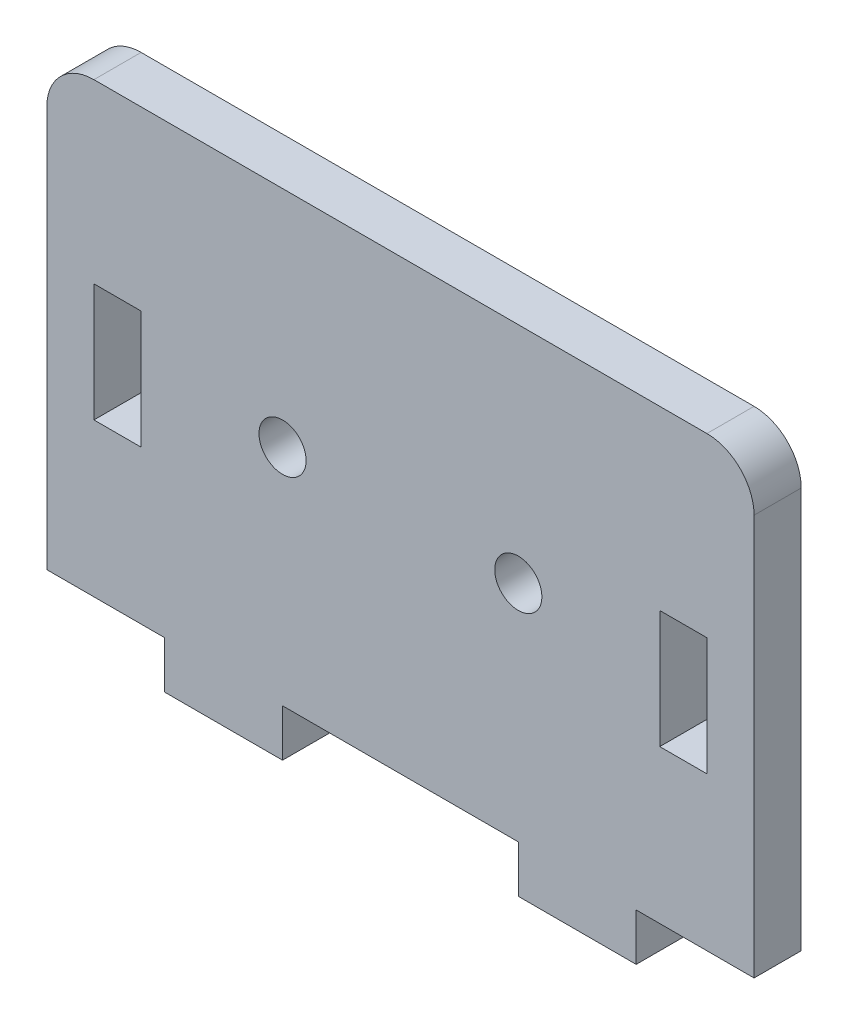
ISO-10303-21;
HEADER;
FILE_DESCRIPTION(('STEP AP214'),'2;1');
FILE_NAME('part.step','',(''),(''),'','','');
FILE_SCHEMA(('AUTOMOTIVE_DESIGN { 1 0 10303 214 1 1 1 1 }'));
ENDSEC;
DATA;
#1=APPLICATION_CONTEXT('core data for automotive mechanical design processes');
#2=APPLICATION_PROTOCOL_DEFINITION('international standard','automotive_design',2000,#1);
#3=PRODUCT_CONTEXT('',#1,'mechanical');
#4=PRODUCT('Part','Part','',(#3));
#5=PRODUCT_RELATED_PRODUCT_CATEGORY('part','',(#4));
#6=PRODUCT_DEFINITION_FORMATION('','',#4);
#7=PRODUCT_DEFINITION_CONTEXT('part definition',#1,'design');
#8=PRODUCT_DEFINITION('design','',#6,#7);
#9=PRODUCT_DEFINITION_SHAPE('','',#8);
#10=(LENGTH_UNIT() NAMED_UNIT(*) SI_UNIT(.MILLI.,.METRE.));
#11=(NAMED_UNIT(*) PLANE_ANGLE_UNIT() SI_UNIT($,.RADIAN.));
#12=(NAMED_UNIT(*) SI_UNIT($,.STERADIAN.) SOLID_ANGLE_UNIT());
#13=UNCERTAINTY_MEASURE_WITH_UNIT(LENGTH_MEASURE(1.E-05),#10,'distance_accuracy_value','');
#14=(GEOMETRIC_REPRESENTATION_CONTEXT(3) GLOBAL_UNCERTAINTY_ASSIGNED_CONTEXT((#13)) GLOBAL_UNIT_ASSIGNED_CONTEXT((#10,
#11,#12)) REPRESENTATION_CONTEXT('',''));
#15=CARTESIAN_POINT('',(0.,0.,0.));
#16=DIRECTION('',(0.,0.,1.));
#17=DIRECTION('',(1.,0.,0.));
#18=AXIS2_PLACEMENT_3D('',#15,#16,#17);
#19=CARTESIAN_POINT('',(-26.,15.,4.));
#20=DIRECTION('',(0.,0.,1.));
#21=DIRECTION('',(1.,0.,0.));
#22=AXIS2_PLACEMENT_3D('',#19,#20,#21);
#23=PLANE('',#22);
#24=DIRECTION('',(1.,0.,0.));
#25=VECTOR('',#24,1.);
#26=CARTESIAN_POINT('',(-26.,-6.,4.));
#27=LINE('',#26,#25);
#28=CARTESIAN_POINT('',(-26.,-6.,4.));
#29=VERTEX_POINT('',#28);
#30=CARTESIAN_POINT('',(-22.,-6.,4.));
#31=VERTEX_POINT('',#30);
#32=EDGE_CURVE('E221',#29,#31,#27,.T.);
#33=ORIENTED_EDGE('',*,*,#32,.F.);
#34=DIRECTION('',(0.,-1.,0.));
#35=VECTOR('',#34,1.);
#36=CARTESIAN_POINT('',(-26.,4.,4.));
#37=LINE('',#36,#35);
#38=CARTESIAN_POINT('',(-26.,4.,4.));
#39=VERTEX_POINT('',#38);
#40=EDGE_CURVE('E219',#39,#29,#37,.T.);
#41=ORIENTED_EDGE('',*,*,#40,.F.);
#42=DIRECTION('',(-1.,0.,0.));
#43=VECTOR('',#42,1.);
#44=CARTESIAN_POINT('',(-26.,4.,4.));
#45=LINE('',#44,#43);
#46=CARTESIAN_POINT('',(-22.,4.,4.));
#47=VERTEX_POINT('',#46);
#48=EDGE_CURVE('E227',#47,#39,#45,.T.);
#49=ORIENTED_EDGE('',*,*,#48,.F.);
#50=DIRECTION('',(0.,1.,0.));
#51=VECTOR('',#50,1.);
#52=CARTESIAN_POINT('',(-22.,4.,4.));
#53=LINE('',#52,#51);
#54=EDGE_CURVE('E224',#31,#47,#53,.T.);
#55=ORIENTED_EDGE('',*,*,#54,.F.);
#56=EDGE_LOOP('',(#33,#41,#49,#55));
#57=FACE_BOUND('',#56,.T.);
#58=CARTESIAN_POINT('',(-10.,0.,4.));
#59=DIRECTION('',(0.,0.,1.));
#60=DIRECTION('',(1.,0.,0.));
#61=AXIS2_PLACEMENT_3D('',#58,#59,#60);
#62=CIRCLE('',#61,2.);
#63=CARTESIAN_POINT('',(-8.,0.,4.));
#64=VERTEX_POINT('',#63);
#65=EDGE_CURVE('E256',#64,#64,#62,.T.);
#66=ORIENTED_EDGE('',*,*,#65,.F.);
#67=EDGE_LOOP('',(#66));
#68=FACE_BOUND('',#67,.T.);
#69=DIRECTION('',(1.,0.,0.));
#70=VECTOR('',#69,1.);
#71=CARTESIAN_POINT('',(30.,-19.,4.));
#72=LINE('',#71,#70);
#73=CARTESIAN_POINT('',(20.,-19.,4.));
#74=VERTEX_POINT('',#73);
#75=CARTESIAN_POINT('',(30.,-19.,4.));
#76=VERTEX_POINT('',#75);
#77=EDGE_CURVE('E262',#74,#76,#72,.T.);
#78=ORIENTED_EDGE('',*,*,#77,.T.);
#79=DIRECTION('',(0.,1.,0.));
#80=VECTOR('',#79,1.);
#81=CARTESIAN_POINT('',(30.,15.,4.));
#82=LINE('',#81,#80);
#83=CARTESIAN_POINT('',(30.,15.,4.));
#84=VERTEX_POINT('',#83);
#85=EDGE_CURVE('E265',#76,#84,#82,.T.);
#86=ORIENTED_EDGE('',*,*,#85,.T.);
#87=CARTESIAN_POINT('',(26.,15.,4.));
#88=DIRECTION('',(0.,0.,1.));
#89=DIRECTION('',(1.,0.,0.));
#90=AXIS2_PLACEMENT_3D('',#87,#88,#89);
#91=CIRCLE('',#90,4.);
#92=CARTESIAN_POINT('',(26.,19.,4.));
#93=VERTEX_POINT('',#92);
#94=EDGE_CURVE('E268',#84,#93,#91,.T.);
#95=ORIENTED_EDGE('',*,*,#94,.T.);
#96=DIRECTION('',(-1.,0.,0.));
#97=VECTOR('',#96,1.);
#98=CARTESIAN_POINT('',(-26.,19.,4.));
#99=LINE('',#98,#97);
#100=CARTESIAN_POINT('',(-26.,19.,4.));
#101=VERTEX_POINT('',#100);
#102=EDGE_CURVE('E270',#93,#101,#99,.T.);
#103=ORIENTED_EDGE('',*,*,#102,.T.);
#104=CARTESIAN_POINT('',(-26.,15.,4.));
#105=DIRECTION('',(0.,0.,1.));
#106=DIRECTION('',(1.,0.,0.));
#107=AXIS2_PLACEMENT_3D('',#104,#105,#106);
#108=CIRCLE('',#107,4.);
#109=CARTESIAN_POINT('',(-30.,15.,4.));
#110=VERTEX_POINT('',#109);
#111=EDGE_CURVE('E272',#101,#110,#108,.T.);
#112=ORIENTED_EDGE('',*,*,#111,.T.);
#113=DIRECTION('',(0.,-1.,0.));
#114=VECTOR('',#113,1.);
#115=CARTESIAN_POINT('',(-30.,15.,4.));
#116=LINE('',#115,#114);
#117=CARTESIAN_POINT('',(-30.,-19.,4.));
#118=VERTEX_POINT('',#117);
#119=EDGE_CURVE('E274',#110,#118,#116,.T.);
#120=ORIENTED_EDGE('',*,*,#119,.T.);
#121=DIRECTION('',(1.,0.,0.));
#122=VECTOR('',#121,1.);
#123=CARTESIAN_POINT('',(-30.,-19.,4.));
#124=LINE('',#123,#122);
#125=CARTESIAN_POINT('',(-20.,-19.,4.));
#126=VERTEX_POINT('',#125);
#127=EDGE_CURVE('E276',#118,#126,#124,.T.);
#128=ORIENTED_EDGE('',*,*,#127,.T.);
#129=DIRECTION('',(0.,-1.,0.));
#130=VECTOR('',#129,1.);
#131=CARTESIAN_POINT('',(-20.,-19.,4.));
#132=LINE('',#131,#130);
#133=CARTESIAN_POINT('',(-20.,-23.,4.));
#134=VERTEX_POINT('',#133);
#135=EDGE_CURVE('E278',#126,#134,#132,.T.);
#136=ORIENTED_EDGE('',*,*,#135,.T.);
#137=DIRECTION('',(1.,0.,0.));
#138=VECTOR('',#137,1.);
#139=CARTESIAN_POINT('',(-20.,-23.,4.));
#140=LINE('',#139,#138);
#141=CARTESIAN_POINT('',(-9.99999999999999,-23.,4.));
#142=VERTEX_POINT('',#141);
#143=EDGE_CURVE('E280',#134,#142,#140,.T.);
#144=ORIENTED_EDGE('',*,*,#143,.T.);
#145=DIRECTION('',(0.,1.,0.));
#146=VECTOR('',#145,1.);
#147=CARTESIAN_POINT('',(-9.99999999999999,-23.,4.));
#148=LINE('',#147,#146);
#149=CARTESIAN_POINT('',(-9.99999999999999,-19.,4.));
#150=VERTEX_POINT('',#149);
#151=EDGE_CURVE('E282',#142,#150,#148,.T.);
#152=ORIENTED_EDGE('',*,*,#151,.T.);
#153=DIRECTION('',(1.,0.,0.));
#154=VECTOR('',#153,1.);
#155=CARTESIAN_POINT('',(10.,-19.,4.));
#156=LINE('',#155,#154);
#157=CARTESIAN_POINT('',(10.,-19.,4.));
#158=VERTEX_POINT('',#157);
#159=EDGE_CURVE('E284',#150,#158,#156,.T.);
#160=ORIENTED_EDGE('',*,*,#159,.T.);
#161=DIRECTION('',(0.,-1.,0.));
#162=VECTOR('',#161,1.);
#163=CARTESIAN_POINT('',(10.,-23.,4.));
#164=LINE('',#163,#162);
#165=CARTESIAN_POINT('',(10.,-23.,4.));
#166=VERTEX_POINT('',#165);
#167=EDGE_CURVE('E286',#158,#166,#164,.T.);
#168=ORIENTED_EDGE('',*,*,#167,.T.);
#169=DIRECTION('',(1.,0.,0.));
#170=VECTOR('',#169,1.);
#171=CARTESIAN_POINT('',(20.,-23.,4.));
#172=LINE('',#171,#170);
#173=CARTESIAN_POINT('',(20.,-23.,4.));
#174=VERTEX_POINT('',#173);
#175=EDGE_CURVE('E288',#166,#174,#172,.T.);
#176=ORIENTED_EDGE('',*,*,#175,.T.);
#177=DIRECTION('',(0.,1.,0.));
#178=VECTOR('',#177,1.);
#179=CARTESIAN_POINT('',(20.,-19.,4.));
#180=LINE('',#179,#178);
#181=EDGE_CURVE('E290',#174,#74,#180,.T.);
#182=ORIENTED_EDGE('',*,*,#181,.T.);
#183=EDGE_LOOP('',(#78,#86,#95,#103,#112,#120,#128,#136,#144,#152,#160,#168,#176,#182));
#184=FACE_BOUND('',#183,.T.);
#185=CARTESIAN_POINT('',(10.,0.,4.));
#186=DIRECTION('',(0.,0.,1.));
#187=DIRECTION('',(1.,0.,0.));
#188=AXIS2_PLACEMENT_3D('',#185,#186,#187);
#189=CIRCLE('',#188,2.);
#190=CARTESIAN_POINT('',(12.,0.,4.));
#191=VERTEX_POINT('',#190);
#192=EDGE_CURVE('E250',#191,#191,#189,.T.);
#193=ORIENTED_EDGE('',*,*,#192,.F.);
#194=EDGE_LOOP('',(#193));
#195=FACE_BOUND('',#194,.T.);
#196=DIRECTION('',(1.,0.,0.));
#197=VECTOR('',#196,1.);
#198=CARTESIAN_POINT('',(22.,-6.,4.));
#199=LINE('',#198,#197);
#200=CARTESIAN_POINT('',(22.,-6.,4.));
#201=VERTEX_POINT('',#200);
#202=CARTESIAN_POINT('',(26.,-6.,4.));
#203=VERTEX_POINT('',#202);
#204=EDGE_CURVE('E191',#201,#203,#199,.T.);
#205=ORIENTED_EDGE('',*,*,#204,.F.);
#206=DIRECTION('',(0.,-1.,0.));
#207=VECTOR('',#206,1.);
#208=CARTESIAN_POINT('',(22.,4.,4.));
#209=LINE('',#208,#207);
#210=CARTESIAN_POINT('',(22.,4.,4.));
#211=VERTEX_POINT('',#210);
#212=EDGE_CURVE('E183',#211,#201,#209,.T.);
#213=ORIENTED_EDGE('',*,*,#212,.F.);
#214=DIRECTION('',(-1.,0.,0.));
#215=VECTOR('',#214,1.);
#216=CARTESIAN_POINT('',(22.,4.,4.));
#217=LINE('',#216,#215);
#218=CARTESIAN_POINT('',(26.,4.,4.));
#219=VERTEX_POINT('',#218);
#220=EDGE_CURVE('E205',#219,#211,#217,.T.);
#221=ORIENTED_EDGE('',*,*,#220,.F.);
#222=DIRECTION('',(0.,1.,0.));
#223=VECTOR('',#222,1.);
#224=CARTESIAN_POINT('',(26.,4.,4.));
#225=LINE('',#224,#223);
#226=EDGE_CURVE('E203',#203,#219,#225,.T.);
#227=ORIENTED_EDGE('',*,*,#226,.F.);
#228=EDGE_LOOP('',(#205,#213,#221,#227));
#229=FACE_BOUND('',#228,.T.);
#230=ADVANCED_FACE('F34',(#57,#68,#184,#195,#229),#23,.T.);
#231=CARTESIAN_POINT('',(-26.,15.,0.));
#232=DIRECTION('',(0.,0.,1.));
#233=DIRECTION('',(1.,0.,0.));
#234=AXIS2_PLACEMENT_3D('',#231,#232,#233);
#235=PLANE('',#234);
#236=DIRECTION('',(0.,-1.,0.));
#237=VECTOR('',#236,1.);
#238=CARTESIAN_POINT('',(-26.,4.,0.));
#239=LINE('',#238,#237);
#240=CARTESIAN_POINT('',(-26.,4.,0.));
#241=VERTEX_POINT('',#240);
#242=CARTESIAN_POINT('',(-26.,-6.,0.));
#243=VERTEX_POINT('',#242);
#244=EDGE_CURVE('E199',#241,#243,#239,.T.);
#245=ORIENTED_EDGE('',*,*,#244,.T.);
#246=DIRECTION('',(1.,0.,0.));
#247=VECTOR('',#246,1.);
#248=CARTESIAN_POINT('',(-26.,-6.,0.));
#249=LINE('',#248,#247);
#250=CARTESIAN_POINT('',(-22.,-6.,0.));
#251=VERTEX_POINT('',#250);
#252=EDGE_CURVE('E232',#243,#251,#249,.T.);
#253=ORIENTED_EDGE('',*,*,#252,.T.);
#254=DIRECTION('',(0.,1.,0.));
#255=VECTOR('',#254,1.);
#256=CARTESIAN_POINT('',(-22.,4.,0.));
#257=LINE('',#256,#255);
#258=CARTESIAN_POINT('',(-22.,4.,0.));
#259=VERTEX_POINT('',#258);
#260=EDGE_CURVE('E235',#251,#259,#257,.T.);
#261=ORIENTED_EDGE('',*,*,#260,.T.);
#262=DIRECTION('',(-1.,0.,0.));
#263=VECTOR('',#262,1.);
#264=CARTESIAN_POINT('',(-26.,4.,0.));
#265=LINE('',#264,#263);
#266=EDGE_CURVE('E222',#259,#241,#265,.T.);
#267=ORIENTED_EDGE('',*,*,#266,.T.);
#268=EDGE_LOOP('',(#245,#253,#261,#267));
#269=FACE_BOUND('',#268,.T.);
#270=CARTESIAN_POINT('',(-10.,0.,0.));
#271=DIRECTION('',(0.,0.,1.));
#272=DIRECTION('',(1.,0.,0.));
#273=AXIS2_PLACEMENT_3D('',#270,#271,#272);
#274=CIRCLE('',#273,2.);
#275=CARTESIAN_POINT('',(-8.,0.,0.));
#276=VERTEX_POINT('',#275);
#277=EDGE_CURVE('E253',#276,#276,#274,.T.);
#278=ORIENTED_EDGE('',*,*,#277,.T.);
#279=EDGE_LOOP('',(#278));
#280=FACE_BOUND('',#279,.T.);
#281=DIRECTION('',(1.,0.,0.));
#282=VECTOR('',#281,1.);
#283=CARTESIAN_POINT('',(30.,-19.,0.));
#284=LINE('',#283,#282);
#285=CARTESIAN_POINT('',(20.,-19.,0.));
#286=VERTEX_POINT('',#285);
#287=CARTESIAN_POINT('',(30.,-19.,0.));
#288=VERTEX_POINT('',#287);
#289=EDGE_CURVE('E259',#286,#288,#284,.T.);
#290=ORIENTED_EDGE('',*,*,#289,.F.);
#291=DIRECTION('',(0.,1.,0.));
#292=VECTOR('',#291,1.);
#293=CARTESIAN_POINT('',(20.,-19.,0.));
#294=LINE('',#293,#292);
#295=CARTESIAN_POINT('',(20.,-23.,0.));
#296=VERTEX_POINT('',#295);
#297=EDGE_CURVE('E266',#296,#286,#294,.T.);
#298=ORIENTED_EDGE('',*,*,#297,.F.);
#299=DIRECTION('',(1.,0.,0.));
#300=VECTOR('',#299,1.);
#301=CARTESIAN_POINT('',(20.,-23.,0.));
#302=LINE('',#301,#300);
#303=CARTESIAN_POINT('',(10.,-23.,0.));
#304=VERTEX_POINT('',#303);
#305=EDGE_CURVE('E317',#304,#296,#302,.T.);
#306=ORIENTED_EDGE('',*,*,#305,.F.);
#307=DIRECTION('',(0.,-1.,0.));
#308=VECTOR('',#307,1.);
#309=CARTESIAN_POINT('',(10.,-23.,0.));
#310=LINE('',#309,#308);
#311=CARTESIAN_POINT('',(10.,-19.,0.));
#312=VERTEX_POINT('',#311);
#313=EDGE_CURVE('E315',#312,#304,#310,.T.);
#314=ORIENTED_EDGE('',*,*,#313,.F.);
#315=DIRECTION('',(1.,0.,0.));
#316=VECTOR('',#315,1.);
#317=CARTESIAN_POINT('',(10.,-19.,0.));
#318=LINE('',#317,#316);
#319=CARTESIAN_POINT('',(-9.99999999999999,-19.,0.));
#320=VERTEX_POINT('',#319);
#321=EDGE_CURVE('E313',#320,#312,#318,.T.);
#322=ORIENTED_EDGE('',*,*,#321,.F.);
#323=DIRECTION('',(0.,1.,0.));
#324=VECTOR('',#323,1.);
#325=CARTESIAN_POINT('',(-9.99999999999999,-23.,0.));
#326=LINE('',#325,#324);
#327=CARTESIAN_POINT('',(-9.99999999999999,-23.,0.));
#328=VERTEX_POINT('',#327);
#329=EDGE_CURVE('E311',#328,#320,#326,.T.);
#330=ORIENTED_EDGE('',*,*,#329,.F.);
#331=DIRECTION('',(1.,0.,0.));
#332=VECTOR('',#331,1.);
#333=CARTESIAN_POINT('',(-20.,-23.,0.));
#334=LINE('',#333,#332);
#335=CARTESIAN_POINT('',(-20.,-23.,0.));
#336=VERTEX_POINT('',#335);
#337=EDGE_CURVE('E309',#336,#328,#334,.T.);
#338=ORIENTED_EDGE('',*,*,#337,.F.);
#339=DIRECTION('',(0.,-1.,0.));
#340=VECTOR('',#339,1.);
#341=CARTESIAN_POINT('',(-20.,-19.,0.));
#342=LINE('',#341,#340);
#343=CARTESIAN_POINT('',(-20.,-19.,0.));
#344=VERTEX_POINT('',#343);
#345=EDGE_CURVE('E307',#344,#336,#342,.T.);
#346=ORIENTED_EDGE('',*,*,#345,.F.);
#347=DIRECTION('',(1.,0.,0.));
#348=VECTOR('',#347,1.);
#349=CARTESIAN_POINT('',(-30.,-19.,0.));
#350=LINE('',#349,#348);
#351=CARTESIAN_POINT('',(-30.,-19.,0.));
#352=VERTEX_POINT('',#351);
#353=EDGE_CURVE('E305',#352,#344,#350,.T.);
#354=ORIENTED_EDGE('',*,*,#353,.F.);
#355=DIRECTION('',(0.,-1.,0.));
#356=VECTOR('',#355,1.);
#357=CARTESIAN_POINT('',(-30.,15.,0.));
#358=LINE('',#357,#356);
#359=CARTESIAN_POINT('',(-30.,15.,0.));
#360=VERTEX_POINT('',#359);
#361=EDGE_CURVE('E303',#360,#352,#358,.T.);
#362=ORIENTED_EDGE('',*,*,#361,.F.);
#363=CARTESIAN_POINT('',(-26.,15.,0.));
#364=DIRECTION('',(0.,0.,1.));
#365=DIRECTION('',(1.,0.,0.));
#366=AXIS2_PLACEMENT_3D('',#363,#364,#365);
#367=CIRCLE('',#366,4.);
#368=CARTESIAN_POINT('',(-26.,19.,0.));
#369=VERTEX_POINT('',#368);
#370=EDGE_CURVE('E301',#369,#360,#367,.T.);
#371=ORIENTED_EDGE('',*,*,#370,.F.);
#372=DIRECTION('',(-1.,0.,0.));
#373=VECTOR('',#372,1.);
#374=CARTESIAN_POINT('',(-26.,19.,0.));
#375=LINE('',#374,#373);
#376=CARTESIAN_POINT('',(26.,19.,0.));
#377=VERTEX_POINT('',#376);
#378=EDGE_CURVE('E299',#377,#369,#375,.T.);
#379=ORIENTED_EDGE('',*,*,#378,.F.);
#380=CARTESIAN_POINT('',(26.,15.,0.));
#381=DIRECTION('',(0.,0.,1.));
#382=DIRECTION('',(1.,0.,0.));
#383=AXIS2_PLACEMENT_3D('',#380,#381,#382);
#384=CIRCLE('',#383,4.);
#385=CARTESIAN_POINT('',(30.,15.,0.));
#386=VERTEX_POINT('',#385);
#387=EDGE_CURVE('E297',#386,#377,#384,.T.);
#388=ORIENTED_EDGE('',*,*,#387,.F.);
#389=DIRECTION('',(0.,1.,0.));
#390=VECTOR('',#389,1.);
#391=CARTESIAN_POINT('',(30.,15.,0.));
#392=LINE('',#391,#390);
#393=EDGE_CURVE('E295',#288,#386,#392,.T.);
#394=ORIENTED_EDGE('',*,*,#393,.F.);
#395=EDGE_LOOP('',(#290,#298,#306,#314,#322,#330,#338,#346,#354,#362,#371,#379,#388,#394));
#396=FACE_BOUND('',#395,.T.);
#397=CARTESIAN_POINT('',(10.,0.,0.));
#398=DIRECTION('',(0.,0.,1.));
#399=DIRECTION('',(1.,0.,0.));
#400=AXIS2_PLACEMENT_3D('',#397,#398,#399);
#401=CIRCLE('',#400,2.);
#402=CARTESIAN_POINT('',(12.,0.,0.));
#403=VERTEX_POINT('',#402);
#404=EDGE_CURVE('E249',#403,#403,#401,.T.);
#405=ORIENTED_EDGE('',*,*,#404,.T.);
#406=EDGE_LOOP('',(#405));
#407=FACE_BOUND('',#406,.T.);
#408=DIRECTION('',(0.,-1.,0.));
#409=VECTOR('',#408,1.);
#410=CARTESIAN_POINT('',(22.,4.,0.));
#411=LINE('',#410,#409);
#412=CARTESIAN_POINT('',(22.,4.,0.));
#413=VERTEX_POINT('',#412);
#414=CARTESIAN_POINT('',(22.,-6.,0.));
#415=VERTEX_POINT('',#414);
#416=EDGE_CURVE('E57',#413,#415,#411,.T.);
#417=ORIENTED_EDGE('',*,*,#416,.T.);
#418=DIRECTION('',(1.,0.,0.));
#419=VECTOR('',#418,1.);
#420=CARTESIAN_POINT('',(22.,-6.,0.));
#421=LINE('',#420,#419);
#422=CARTESIAN_POINT('',(26.,-6.,0.));
#423=VERTEX_POINT('',#422);
#424=EDGE_CURVE('E198',#415,#423,#421,.T.);
#425=ORIENTED_EDGE('',*,*,#424,.T.);
#426=DIRECTION('',(0.,1.,0.));
#427=VECTOR('',#426,1.);
#428=CARTESIAN_POINT('',(26.,4.,0.));
#429=LINE('',#428,#427);
#430=CARTESIAN_POINT('',(26.,4.,0.));
#431=VERTEX_POINT('',#430);
#432=EDGE_CURVE('E211',#423,#431,#429,.T.);
#433=ORIENTED_EDGE('',*,*,#432,.T.);
#434=DIRECTION('',(-1.,0.,0.));
#435=VECTOR('',#434,1.);
#436=CARTESIAN_POINT('',(22.,4.,0.));
#437=LINE('',#436,#435);
#438=EDGE_CURVE('E192',#431,#413,#437,.T.);
#439=ORIENTED_EDGE('',*,*,#438,.T.);
#440=EDGE_LOOP('',(#417,#425,#433,#439));
#441=FACE_BOUND('',#440,.T.);
#442=ADVANCED_FACE('F365',(#269,#280,#396,#407,#441),#235,.F.);
#443=CARTESIAN_POINT('',(30.,-19.,4.));
#444=DIRECTION('',(0.,1.,0.));
#445=DIRECTION('',(0.,0.,1.));
#446=AXIS2_PLACEMENT_3D('',#443,#444,#445);
#447=PLANE('',#446);
#448=ORIENTED_EDGE('',*,*,#289,.T.);
#449=DIRECTION('',(0.,0.,-1.));
#450=VECTOR('',#449,1.);
#451=CARTESIAN_POINT('',(30.,-19.,4.));
#452=LINE('',#451,#450);
#453=EDGE_CURVE('E11',#76,#288,#452,.T.);
#454=ORIENTED_EDGE('',*,*,#453,.F.);
#455=ORIENTED_EDGE('',*,*,#77,.F.);
#456=DIRECTION('',(0.,0.,-1.));
#457=VECTOR('',#456,1.);
#458=CARTESIAN_POINT('',(20.,-19.,4.));
#459=LINE('',#458,#457);
#460=EDGE_CURVE('E292',#74,#286,#459,.T.);
#461=ORIENTED_EDGE('',*,*,#460,.T.);
#462=EDGE_LOOP('',(#448,#454,#455,#461));
#463=FACE_BOUND('',#462,.T.);
#464=ADVANCED_FACE('F36',(#463),#447,.F.);
#465=CARTESIAN_POINT('',(30.,15.,4.));
#466=DIRECTION('',(-1.,0.,0.));
#467=DIRECTION('',(0.,-1.,0.));
#468=AXIS2_PLACEMENT_3D('',#465,#466,#467);
#469=PLANE('',#468);
#470=ORIENTED_EDGE('',*,*,#393,.T.);
#471=DIRECTION('',(0.,0.,-1.));
#472=VECTOR('',#471,1.);
#473=CARTESIAN_POINT('',(30.,15.,4.));
#474=LINE('',#473,#472);
#475=EDGE_CURVE('E42',#84,#386,#474,.T.);
#476=ORIENTED_EDGE('',*,*,#475,.F.);
#477=ORIENTED_EDGE('',*,*,#85,.F.);
#478=ORIENTED_EDGE('',*,*,#453,.T.);
#479=EDGE_LOOP('',(#470,#476,#477,#478));
#480=FACE_BOUND('',#479,.T.);
#481=ADVANCED_FACE('F383',(#480),#469,.F.);
#482=CARTESIAN_POINT('',(26.,15.,4.));
#483=DIRECTION('',(0.,0.,-1.));
#484=DIRECTION('',(-1.,0.,0.));
#485=AXIS2_PLACEMENT_3D('',#482,#483,#484);
#486=CYLINDRICAL_SURFACE('',#485,4.);
#487=ORIENTED_EDGE('',*,*,#387,.T.);
#488=DIRECTION('',(0.,0.,-1.));
#489=VECTOR('',#488,1.);
#490=CARTESIAN_POINT('',(26.,19.,4.));
#491=LINE('',#490,#489);
#492=EDGE_CURVE('E352',#93,#377,#491,.T.);
#493=ORIENTED_EDGE('',*,*,#492,.F.);
#494=ORIENTED_EDGE('',*,*,#94,.F.);
#495=ORIENTED_EDGE('',*,*,#475,.T.);
#496=EDGE_LOOP('',(#487,#493,#494,#495));
#497=FACE_BOUND('',#496,.T.);
#498=ADVANCED_FACE('F359',(#497),#486,.T.);
#499=CARTESIAN_POINT('',(-26.,19.,4.));
#500=DIRECTION('',(0.,-1.,0.));
#501=DIRECTION('',(0.,0.,-1.));
#502=AXIS2_PLACEMENT_3D('',#499,#500,#501);
#503=PLANE('',#502);
#504=ORIENTED_EDGE('',*,*,#378,.T.);
#505=DIRECTION('',(0.,0.,-1.));
#506=VECTOR('',#505,1.);
#507=CARTESIAN_POINT('',(-26.,19.,4.));
#508=LINE('',#507,#506);
#509=EDGE_CURVE('E349',#101,#369,#508,.T.);
#510=ORIENTED_EDGE('',*,*,#509,.F.);
#511=ORIENTED_EDGE('',*,*,#102,.F.);
#512=ORIENTED_EDGE('',*,*,#492,.T.);
#513=EDGE_LOOP('',(#504,#510,#511,#512));
#514=FACE_BOUND('',#513,.T.);
#515=ADVANCED_FACE('F371',(#514),#503,.F.);
#516=CARTESIAN_POINT('',(-26.,15.,4.));
#517=DIRECTION('',(0.,0.,-1.));
#518=DIRECTION('',(-1.,0.,0.));
#519=AXIS2_PLACEMENT_3D('',#516,#517,#518);
#520=CYLINDRICAL_SURFACE('',#519,4.);
#521=ORIENTED_EDGE('',*,*,#370,.T.);
#522=DIRECTION('',(0.,0.,-1.));
#523=VECTOR('',#522,1.);
#524=CARTESIAN_POINT('',(-30.,15.,4.));
#525=LINE('',#524,#523);
#526=EDGE_CURVE('E346',#110,#360,#525,.T.);
#527=ORIENTED_EDGE('',*,*,#526,.F.);
#528=ORIENTED_EDGE('',*,*,#111,.F.);
#529=ORIENTED_EDGE('',*,*,#509,.T.);
#530=EDGE_LOOP('',(#521,#527,#528,#529));
#531=FACE_BOUND('',#530,.T.);
#532=ADVANCED_FACE('F375',(#531),#520,.T.);
#533=CARTESIAN_POINT('',(-30.,15.,4.));
#534=DIRECTION('',(1.,0.,0.));
#535=DIRECTION('',(0.,0.,-1.));
#536=AXIS2_PLACEMENT_3D('',#533,#534,#535);
#537=PLANE('',#536);
#538=ORIENTED_EDGE('',*,*,#361,.T.);
#539=DIRECTION('',(0.,0.,-1.));
#540=VECTOR('',#539,1.);
#541=CARTESIAN_POINT('',(-30.,-19.,4.));
#542=LINE('',#541,#540);
#543=EDGE_CURVE('E343',#118,#352,#542,.T.);
#544=ORIENTED_EDGE('',*,*,#543,.F.);
#545=ORIENTED_EDGE('',*,*,#119,.F.);
#546=ORIENTED_EDGE('',*,*,#526,.T.);
#547=EDGE_LOOP('',(#538,#544,#545,#546));
#548=FACE_BOUND('',#547,.T.);
#549=ADVANCED_FACE('F426',(#548),#537,.F.);
#550=CARTESIAN_POINT('',(-30.,-19.,4.));
#551=DIRECTION('',(0.,1.,0.));
#552=DIRECTION('',(-1.,0.,0.));
#553=AXIS2_PLACEMENT_3D('',#550,#551,#552);
#554=PLANE('',#553);
#555=ORIENTED_EDGE('',*,*,#353,.T.);
#556=DIRECTION('',(0.,0.,-1.));
#557=VECTOR('',#556,1.);
#558=CARTESIAN_POINT('',(-20.,-19.,4.));
#559=LINE('',#558,#557);
#560=EDGE_CURVE('E340',#126,#344,#559,.T.);
#561=ORIENTED_EDGE('',*,*,#560,.F.);
#562=ORIENTED_EDGE('',*,*,#127,.F.);
#563=ORIENTED_EDGE('',*,*,#543,.T.);
#564=EDGE_LOOP('',(#555,#561,#562,#563));
#565=FACE_BOUND('',#564,.T.);
#566=ADVANCED_FACE('F424',(#565),#554,.F.);
#567=CARTESIAN_POINT('',(-20.,-19.,4.));
#568=DIRECTION('',(1.,0.,0.));
#569=DIRECTION('',(0.,0.,-1.));
#570=AXIS2_PLACEMENT_3D('',#567,#568,#569);
#571=PLANE('',#570);
#572=ORIENTED_EDGE('',*,*,#345,.T.);
#573=DIRECTION('',(0.,0.,-1.));
#574=VECTOR('',#573,1.);
#575=CARTESIAN_POINT('',(-20.,-23.,4.));
#576=LINE('',#575,#574);
#577=EDGE_CURVE('E337',#134,#336,#576,.T.);
#578=ORIENTED_EDGE('',*,*,#577,.F.);
#579=ORIENTED_EDGE('',*,*,#135,.F.);
#580=ORIENTED_EDGE('',*,*,#560,.T.);
#581=EDGE_LOOP('',(#572,#578,#579,#580));
#582=FACE_BOUND('',#581,.T.);
#583=ADVANCED_FACE('F419',(#582),#571,.F.);
#584=CARTESIAN_POINT('',(-20.,-23.,4.));
#585=DIRECTION('',(0.,1.,0.));
#586=DIRECTION('',(0.,0.,1.));
#587=AXIS2_PLACEMENT_3D('',#584,#585,#586);
#588=PLANE('',#587);
#589=ORIENTED_EDGE('',*,*,#337,.T.);
#590=DIRECTION('',(0.,0.,-1.));
#591=VECTOR('',#590,1.);
#592=CARTESIAN_POINT('',(-9.99999999999999,-23.,4.));
#593=LINE('',#592,#591);
#594=EDGE_CURVE('E334',#142,#328,#593,.T.);
#595=ORIENTED_EDGE('',*,*,#594,.F.);
#596=ORIENTED_EDGE('',*,*,#143,.F.);
#597=ORIENTED_EDGE('',*,*,#577,.T.);
#598=EDGE_LOOP('',(#589,#595,#596,#597));
#599=FACE_BOUND('',#598,.T.);
#600=ADVANCED_FACE('F414',(#599),#588,.F.);
#601=CARTESIAN_POINT('',(-9.99999999999999,-23.,4.));
#602=DIRECTION('',(-1.,0.,0.));
#603=DIRECTION('',(0.,0.,1.));
#604=AXIS2_PLACEMENT_3D('',#601,#602,#603);
#605=PLANE('',#604);
#606=ORIENTED_EDGE('',*,*,#329,.T.);
#607=DIRECTION('',(0.,0.,-1.));
#608=VECTOR('',#607,1.);
#609=CARTESIAN_POINT('',(-9.99999999999999,-19.,4.));
#610=LINE('',#609,#608);
#611=EDGE_CURVE('E331',#150,#320,#610,.T.);
#612=ORIENTED_EDGE('',*,*,#611,.F.);
#613=ORIENTED_EDGE('',*,*,#151,.F.);
#614=ORIENTED_EDGE('',*,*,#594,.T.);
#615=EDGE_LOOP('',(#606,#612,#613,#614));
#616=FACE_BOUND('',#615,.T.);
#617=ADVANCED_FACE('F410',(#616),#605,.F.);
#618=CARTESIAN_POINT('',(10.,-19.,4.));
#619=DIRECTION('',(0.,1.,0.));
#620=DIRECTION('',(-1.,0.,0.));
#621=AXIS2_PLACEMENT_3D('',#618,#619,#620);
#622=PLANE('',#621);
#623=ORIENTED_EDGE('',*,*,#321,.T.);
#624=DIRECTION('',(0.,0.,-1.));
#625=VECTOR('',#624,1.);
#626=CARTESIAN_POINT('',(10.,-19.,4.));
#627=LINE('',#626,#625);
#628=EDGE_CURVE('E328',#158,#312,#627,.T.);
#629=ORIENTED_EDGE('',*,*,#628,.F.);
#630=ORIENTED_EDGE('',*,*,#159,.F.);
#631=ORIENTED_EDGE('',*,*,#611,.T.);
#632=EDGE_LOOP('',(#623,#629,#630,#631));
#633=FACE_BOUND('',#632,.T.);
#634=ADVANCED_FACE('F405',(#633),#622,.F.);
#635=CARTESIAN_POINT('',(10.,-23.,4.));
#636=DIRECTION('',(1.,0.,0.));
#637=DIRECTION('',(0.,0.,-1.));
#638=AXIS2_PLACEMENT_3D('',#635,#636,#637);
#639=PLANE('',#638);
#640=ORIENTED_EDGE('',*,*,#313,.T.);
#641=DIRECTION('',(0.,0.,-1.));
#642=VECTOR('',#641,1.);
#643=CARTESIAN_POINT('',(10.,-23.,4.));
#644=LINE('',#643,#642);
#645=EDGE_CURVE('E325',#166,#304,#644,.T.);
#646=ORIENTED_EDGE('',*,*,#645,.F.);
#647=ORIENTED_EDGE('',*,*,#167,.F.);
#648=ORIENTED_EDGE('',*,*,#628,.T.);
#649=EDGE_LOOP('',(#640,#646,#647,#648));
#650=FACE_BOUND('',#649,.T.);
#651=ADVANCED_FACE('F399',(#650),#639,.F.);
#652=CARTESIAN_POINT('',(20.,-23.,4.));
#653=DIRECTION('',(0.,1.,0.));
#654=DIRECTION('',(-1.,0.,0.));
#655=AXIS2_PLACEMENT_3D('',#652,#653,#654);
#656=PLANE('',#655);
#657=ORIENTED_EDGE('',*,*,#305,.T.);
#658=DIRECTION('',(0.,0.,-1.));
#659=VECTOR('',#658,1.);
#660=CARTESIAN_POINT('',(20.,-23.,4.));
#661=LINE('',#660,#659);
#662=EDGE_CURVE('E322',#174,#296,#661,.T.);
#663=ORIENTED_EDGE('',*,*,#662,.F.);
#664=ORIENTED_EDGE('',*,*,#175,.F.);
#665=ORIENTED_EDGE('',*,*,#645,.T.);
#666=EDGE_LOOP('',(#657,#663,#664,#665));
#667=FACE_BOUND('',#666,.T.);
#668=ADVANCED_FACE('F395',(#667),#656,.F.);
#669=CARTESIAN_POINT('',(20.,-19.,4.));
#670=DIRECTION('',(-1.,0.,0.));
#671=DIRECTION('',(0.,0.,1.));
#672=AXIS2_PLACEMENT_3D('',#669,#670,#671);
#673=PLANE('',#672);
#674=ORIENTED_EDGE('',*,*,#297,.T.);
#675=ORIENTED_EDGE('',*,*,#460,.F.);
#676=ORIENTED_EDGE('',*,*,#181,.F.);
#677=ORIENTED_EDGE('',*,*,#662,.T.);
#678=EDGE_LOOP('',(#674,#675,#676,#677));
#679=FACE_BOUND('',#678,.T.);
#680=ADVANCED_FACE('F390',(#679),#673,.F.);
#681=CARTESIAN_POINT('',(-10.,0.,4.));
#682=DIRECTION('',(0.,0.,-1.));
#683=DIRECTION('',(-1.,0.,0.));
#684=AXIS2_PLACEMENT_3D('',#681,#682,#683);
#685=CYLINDRICAL_SURFACE('',#684,2.);
#686=ORIENTED_EDGE('',*,*,#65,.T.);
#687=EDGE_LOOP('',(#686));
#688=FACE_BOUND('',#687,.T.);
#689=ORIENTED_EDGE('',*,*,#277,.F.);
#690=EDGE_LOOP('',(#689));
#691=FACE_BOUND('',#690,.T.);
#692=ADVANCED_FACE('F446',(#688,#691),#685,.F.);
#693=CARTESIAN_POINT('',(10.,0.,4.));
#694=DIRECTION('',(0.,0.,-1.));
#695=DIRECTION('',(-1.,0.,0.));
#696=AXIS2_PLACEMENT_3D('',#693,#694,#695);
#697=CYLINDRICAL_SURFACE('',#696,2.);
#698=ORIENTED_EDGE('',*,*,#192,.T.);
#699=EDGE_LOOP('',(#698));
#700=FACE_BOUND('',#699,.T.);
#701=ORIENTED_EDGE('',*,*,#404,.F.);
#702=EDGE_LOOP('',(#701));
#703=FACE_BOUND('',#702,.T.);
#704=ADVANCED_FACE('F496',(#700,#703),#697,.F.);
#705=CARTESIAN_POINT('',(-26.,4.,4.));
#706=DIRECTION('',(1.,0.,0.));
#707=DIRECTION('',(0.,0.,-1.));
#708=AXIS2_PLACEMENT_3D('',#705,#706,#707);
#709=PLANE('',#708);
#710=ORIENTED_EDGE('',*,*,#244,.F.);
#711=DIRECTION('',(0.,0.,-1.));
#712=VECTOR('',#711,1.);
#713=CARTESIAN_POINT('',(-26.,4.,4.));
#714=LINE('',#713,#712);
#715=EDGE_CURVE('E229',#39,#241,#714,.T.);
#716=ORIENTED_EDGE('',*,*,#715,.F.);
#717=ORIENTED_EDGE('',*,*,#40,.T.);
#718=DIRECTION('',(0.,0.,-1.));
#719=VECTOR('',#718,1.);
#720=CARTESIAN_POINT('',(-26.,-6.,4.));
#721=LINE('',#720,#719);
#722=EDGE_CURVE('E246',#29,#243,#721,.T.);
#723=ORIENTED_EDGE('',*,*,#722,.T.);
#724=EDGE_LOOP('',(#710,#716,#717,#723));
#725=FACE_BOUND('',#724,.T.);
#726=ADVANCED_FACE('F503',(#725),#709,.T.);
#727=CARTESIAN_POINT('',(-26.,-6.,4.));
#728=DIRECTION('',(0.,1.,0.));
#729=DIRECTION('',(-1.,0.,0.));
#730=AXIS2_PLACEMENT_3D('',#727,#728,#729);
#731=PLANE('',#730);
#732=ORIENTED_EDGE('',*,*,#252,.F.);
#733=ORIENTED_EDGE('',*,*,#722,.F.);
#734=ORIENTED_EDGE('',*,*,#32,.T.);
#735=DIRECTION('',(0.,0.,-1.));
#736=VECTOR('',#735,1.);
#737=CARTESIAN_POINT('',(-22.,-6.,4.));
#738=LINE('',#737,#736);
#739=EDGE_CURVE('E244',#31,#251,#738,.T.);
#740=ORIENTED_EDGE('',*,*,#739,.T.);
#741=EDGE_LOOP('',(#732,#733,#734,#740));
#742=FACE_BOUND('',#741,.T.);
#743=ADVANCED_FACE('F510',(#742),#731,.T.);
#744=CARTESIAN_POINT('',(-22.,4.,4.));
#745=DIRECTION('',(-1.,0.,0.));
#746=DIRECTION('',(0.,0.,1.));
#747=AXIS2_PLACEMENT_3D('',#744,#745,#746);
#748=PLANE('',#747);
#749=ORIENTED_EDGE('',*,*,#260,.F.);
#750=ORIENTED_EDGE('',*,*,#739,.F.);
#751=ORIENTED_EDGE('',*,*,#54,.T.);
#752=DIRECTION('',(0.,0.,-1.));
#753=VECTOR('',#752,1.);
#754=CARTESIAN_POINT('',(-22.,4.,4.));
#755=LINE('',#754,#753);
#756=EDGE_CURVE('E242',#47,#259,#755,.T.);
#757=ORIENTED_EDGE('',*,*,#756,.T.);
#758=EDGE_LOOP('',(#749,#750,#751,#757));
#759=FACE_BOUND('',#758,.T.);
#760=ADVANCED_FACE('F518',(#759),#748,.T.);
#761=CARTESIAN_POINT('',(-26.,4.,4.));
#762=DIRECTION('',(0.,-1.,0.));
#763=DIRECTION('',(1.,0.,0.));
#764=AXIS2_PLACEMENT_3D('',#761,#762,#763);
#765=PLANE('',#764);
#766=ORIENTED_EDGE('',*,*,#266,.F.);
#767=ORIENTED_EDGE('',*,*,#756,.F.);
#768=ORIENTED_EDGE('',*,*,#48,.T.);
#769=ORIENTED_EDGE('',*,*,#715,.T.);
#770=EDGE_LOOP('',(#766,#767,#768,#769));
#771=FACE_BOUND('',#770,.T.);
#772=ADVANCED_FACE('F526',(#771),#765,.T.);
#773=CARTESIAN_POINT('',(22.,4.,4.));
#774=DIRECTION('',(1.,0.,0.));
#775=DIRECTION('',(0.,0.,-1.));
#776=AXIS2_PLACEMENT_3D('',#773,#774,#775);
#777=PLANE('',#776);
#778=ORIENTED_EDGE('',*,*,#416,.F.);
#779=DIRECTION('',(0.,0.,-1.));
#780=VECTOR('',#779,1.);
#781=CARTESIAN_POINT('',(22.,4.,4.));
#782=LINE('',#781,#780);
#783=EDGE_CURVE('E187',#211,#413,#782,.T.);
#784=ORIENTED_EDGE('',*,*,#783,.F.);
#785=ORIENTED_EDGE('',*,*,#212,.T.);
#786=DIRECTION('',(0.,0.,-1.));
#787=VECTOR('',#786,1.);
#788=CARTESIAN_POINT('',(22.,-6.,4.));
#789=LINE('',#788,#787);
#790=EDGE_CURVE('E186',#201,#415,#789,.T.);
#791=ORIENTED_EDGE('',*,*,#790,.T.);
#792=EDGE_LOOP('',(#778,#784,#785,#791));
#793=FACE_BOUND('',#792,.T.);
#794=ADVANCED_FACE('F185',(#793),#777,.T.);
#795=CARTESIAN_POINT('',(22.,-6.,4.));
#796=DIRECTION('',(0.,1.,0.));
#797=DIRECTION('',(0.,0.,1.));
#798=AXIS2_PLACEMENT_3D('',#795,#796,#797);
#799=PLANE('',#798);
#800=ORIENTED_EDGE('',*,*,#424,.F.);
#801=ORIENTED_EDGE('',*,*,#790,.F.);
#802=ORIENTED_EDGE('',*,*,#204,.T.);
#803=DIRECTION('',(0.,0.,-1.));
#804=VECTOR('',#803,1.);
#805=CARTESIAN_POINT('',(26.,-6.,4.));
#806=LINE('',#805,#804);
#807=EDGE_CURVE('E200',#203,#423,#806,.T.);
#808=ORIENTED_EDGE('',*,*,#807,.T.);
#809=EDGE_LOOP('',(#800,#801,#802,#808));
#810=FACE_BOUND('',#809,.T.);
#811=ADVANCED_FACE('F195',(#810),#799,.T.);
#812=CARTESIAN_POINT('',(26.,4.,4.));
#813=DIRECTION('',(-1.,0.,0.));
#814=DIRECTION('',(0.,0.,1.));
#815=AXIS2_PLACEMENT_3D('',#812,#813,#814);
#816=PLANE('',#815);
#817=ORIENTED_EDGE('',*,*,#432,.F.);
#818=ORIENTED_EDGE('',*,*,#807,.F.);
#819=ORIENTED_EDGE('',*,*,#226,.T.);
#820=DIRECTION('',(0.,0.,-1.));
#821=VECTOR('',#820,1.);
#822=CARTESIAN_POINT('',(26.,4.,4.));
#823=LINE('',#822,#821);
#824=EDGE_CURVE('E49',#219,#431,#823,.T.);
#825=ORIENTED_EDGE('',*,*,#824,.T.);
#826=EDGE_LOOP('',(#817,#818,#819,#825));
#827=FACE_BOUND('',#826,.T.);
#828=ADVANCED_FACE('F547',(#827),#816,.T.);
#829=CARTESIAN_POINT('',(22.,4.,4.));
#830=DIRECTION('',(0.,-1.,0.));
#831=DIRECTION('',(0.,0.,-1.));
#832=AXIS2_PLACEMENT_3D('',#829,#830,#831);
#833=PLANE('',#832);
#834=ORIENTED_EDGE('',*,*,#438,.F.);
#835=ORIENTED_EDGE('',*,*,#824,.F.);
#836=ORIENTED_EDGE('',*,*,#220,.T.);
#837=ORIENTED_EDGE('',*,*,#783,.T.);
#838=EDGE_LOOP('',(#834,#835,#836,#837));
#839=FACE_BOUND('',#838,.T.);
#840=ADVANCED_FACE('F554',(#839),#833,.T.);
#841=CLOSED_SHELL('',(#230,#442,#464,#481,#498,#515,#532,#549,#566,#583,#600,#617,#634,#651,
#668,#680,#692,#704,#726,#743,#760,#772,#794,#811,#828,#840));
#842=MANIFOLD_SOLID_BREP('B2',#841);
#843=ADVANCED_BREP_SHAPE_REPRESENTATION('',(#18,#842),#14);
#844=SHAPE_DEFINITION_REPRESENTATION(#9,#843);
ENDSEC;
END-ISO-10303-21;
